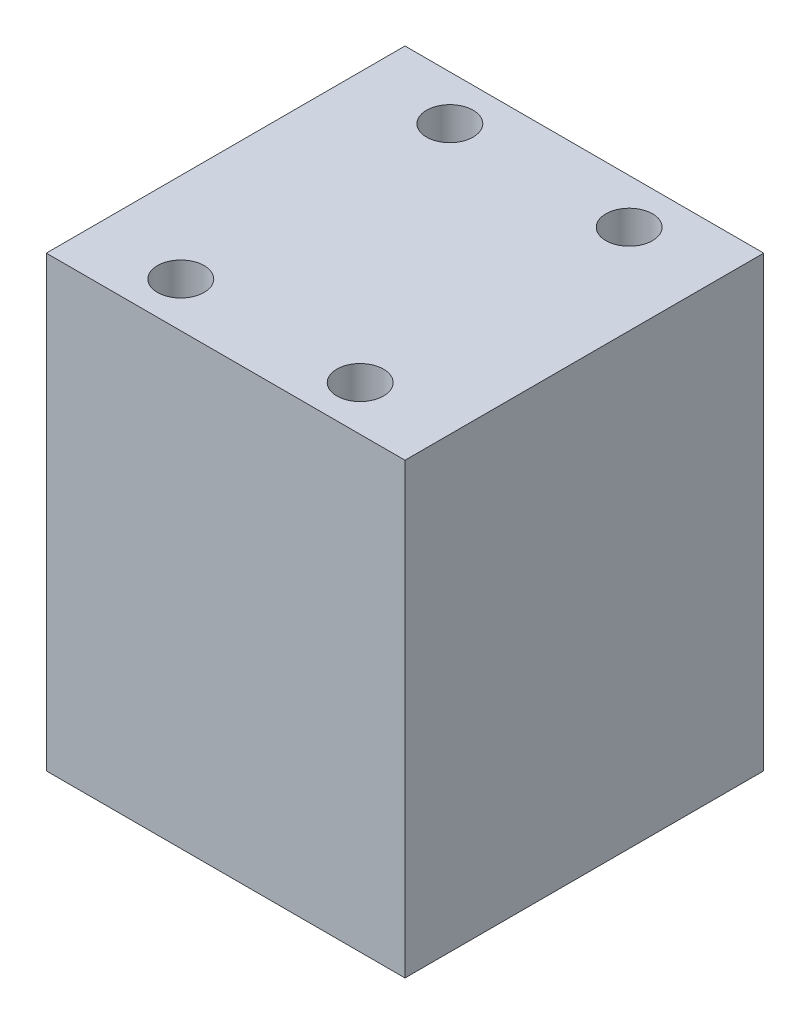
ISO-10303-21;
HEADER;
FILE_DESCRIPTION(('STEP AP214'),'2;1');
FILE_NAME('part.step','',(''),(''),'','','');
FILE_SCHEMA(('AUTOMOTIVE_DESIGN { 1 0 10303 214 1 1 1 1 }'));
ENDSEC;
DATA;
#1=APPLICATION_CONTEXT('core data for automotive mechanical design processes');
#2=APPLICATION_PROTOCOL_DEFINITION('international standard','automotive_design',2000,#1);
#3=PRODUCT_CONTEXT('',#1,'mechanical');
#4=PRODUCT('Part','Part','',(#3));
#5=PRODUCT_RELATED_PRODUCT_CATEGORY('part','',(#4));
#6=PRODUCT_DEFINITION_FORMATION('','',#4);
#7=PRODUCT_DEFINITION_CONTEXT('part definition',#1,'design');
#8=PRODUCT_DEFINITION('design','',#6,#7);
#9=PRODUCT_DEFINITION_SHAPE('','',#8);
#10=(LENGTH_UNIT() NAMED_UNIT(*) SI_UNIT(.MILLI.,.METRE.));
#11=(NAMED_UNIT(*) PLANE_ANGLE_UNIT() SI_UNIT($,.RADIAN.));
#12=(NAMED_UNIT(*) SI_UNIT($,.STERADIAN.) SOLID_ANGLE_UNIT());
#13=UNCERTAINTY_MEASURE_WITH_UNIT(LENGTH_MEASURE(1.E-05),#10,'distance_accuracy_value','');
#14=(GEOMETRIC_REPRESENTATION_CONTEXT(3) GLOBAL_UNCERTAINTY_ASSIGNED_CONTEXT((#13)) GLOBAL_UNIT_ASSIGNED_CONTEXT((#10,
#11,#12)) REPRESENTATION_CONTEXT('',''));
#15=CARTESIAN_POINT('',(0.,0.,0.));
#16=DIRECTION('',(0.,0.,1.));
#17=DIRECTION('',(1.,0.,0.));
#18=AXIS2_PLACEMENT_3D('',#15,#16,#17);
#19=CARTESIAN_POINT('',(20.,50.,-20.));
#20=DIRECTION('',(-1.,0.,0.));
#21=DIRECTION('',(0.,0.,1.));
#22=AXIS2_PLACEMENT_3D('',#19,#20,#21);
#23=PLANE('',#22);
#24=DIRECTION('',(0.,0.,-1.));
#25=VECTOR('',#24,1.);
#26=CARTESIAN_POINT('',(20.,0.,-20.));
#27=LINE('',#26,#25);
#28=CARTESIAN_POINT('',(20.,0.,20.));
#29=VERTEX_POINT('',#28);
#30=CARTESIAN_POINT('',(20.,0.,-20.));
#31=VERTEX_POINT('',#30);
#32=EDGE_CURVE('E96',#29,#31,#27,.T.);
#33=ORIENTED_EDGE('',*,*,#32,.T.);
#34=DIRECTION('',(0.,-1.,0.));
#35=VECTOR('',#34,1.);
#36=CARTESIAN_POINT('',(20.,50.,-20.));
#37=LINE('',#36,#35);
#38=CARTESIAN_POINT('',(20.,50.,-20.));
#39=VERTEX_POINT('',#38);
#40=EDGE_CURVE('E11',#39,#31,#37,.T.);
#41=ORIENTED_EDGE('',*,*,#40,.F.);
#42=DIRECTION('',(0.,0.,-1.));
#43=VECTOR('',#42,1.);
#44=CARTESIAN_POINT('',(20.,50.,-20.));
#45=LINE('',#44,#43);
#46=CARTESIAN_POINT('',(20.,50.,20.));
#47=VERTEX_POINT('',#46);
#48=EDGE_CURVE('E84',#47,#39,#45,.T.);
#49=ORIENTED_EDGE('',*,*,#48,.F.);
#50=DIRECTION('',(0.,-1.,0.));
#51=VECTOR('',#50,1.);
#52=CARTESIAN_POINT('',(20.,50.,20.));
#53=LINE('',#52,#51);
#54=EDGE_CURVE('E92',#47,#29,#53,.T.);
#55=ORIENTED_EDGE('',*,*,#54,.T.);
#56=EDGE_LOOP('',(#33,#41,#49,#55));
#57=FACE_BOUND('',#56,.T.);
#58=ADVANCED_FACE('F33',(#57),#23,.F.);
#59=CARTESIAN_POINT('',(-20.,50.,-20.));
#60=DIRECTION('',(0.,0.,1.));
#61=DIRECTION('',(1.,0.,0.));
#62=AXIS2_PLACEMENT_3D('',#59,#60,#61);
#63=PLANE('',#62);
#64=DIRECTION('',(-1.,0.,0.));
#65=VECTOR('',#64,1.);
#66=CARTESIAN_POINT('',(-20.,0.,-20.));
#67=LINE('',#66,#65);
#68=CARTESIAN_POINT('',(-20.,0.,-20.));
#69=VERTEX_POINT('',#68);
#70=EDGE_CURVE('E88',#31,#69,#67,.T.);
#71=ORIENTED_EDGE('',*,*,#70,.T.);
#72=DIRECTION('',(0.,-1.,0.));
#73=VECTOR('',#72,1.);
#74=CARTESIAN_POINT('',(-20.,50.,-20.));
#75=LINE('',#74,#73);
#76=CARTESIAN_POINT('',(-20.,50.,-20.));
#77=VERTEX_POINT('',#76);
#78=EDGE_CURVE('E41',#77,#69,#75,.T.);
#79=ORIENTED_EDGE('',*,*,#78,.F.);
#80=DIRECTION('',(-1.,0.,0.));
#81=VECTOR('',#80,1.);
#82=CARTESIAN_POINT('',(-20.,50.,-20.));
#83=LINE('',#82,#81);
#84=EDGE_CURVE('E79',#39,#77,#83,.T.);
#85=ORIENTED_EDGE('',*,*,#84,.F.);
#86=ORIENTED_EDGE('',*,*,#40,.T.);
#87=EDGE_LOOP('',(#71,#79,#85,#86));
#88=FACE_BOUND('',#87,.T.);
#89=ADVANCED_FACE('F87',(#88),#63,.F.);
#90=CARTESIAN_POINT('',(-20.,50.,-20.));
#91=DIRECTION('',(1.,0.,0.));
#92=DIRECTION('',(0.,0.,-1.));
#93=AXIS2_PLACEMENT_3D('',#90,#91,#92);
#94=PLANE('',#93);
#95=DIRECTION('',(0.,0.,1.));
#96=VECTOR('',#95,1.);
#97=CARTESIAN_POINT('',(-20.,0.,-20.));
#98=LINE('',#97,#96);
#99=CARTESIAN_POINT('',(-20.,0.,20.));
#100=VERTEX_POINT('',#99);
#101=EDGE_CURVE('E66',#69,#100,#98,.T.);
#102=ORIENTED_EDGE('',*,*,#101,.T.);
#103=DIRECTION('',(0.,-1.,0.));
#104=VECTOR('',#103,1.);
#105=CARTESIAN_POINT('',(-20.,50.,20.));
#106=LINE('',#105,#104);
#107=CARTESIAN_POINT('',(-20.,50.,20.));
#108=VERTEX_POINT('',#107);
#109=EDGE_CURVE('E89',#108,#100,#106,.T.);
#110=ORIENTED_EDGE('',*,*,#109,.F.);
#111=DIRECTION('',(0.,0.,1.));
#112=VECTOR('',#111,1.);
#113=CARTESIAN_POINT('',(-20.,50.,-20.));
#114=LINE('',#113,#112);
#115=EDGE_CURVE('E82',#77,#108,#114,.T.);
#116=ORIENTED_EDGE('',*,*,#115,.F.);
#117=ORIENTED_EDGE('',*,*,#78,.T.);
#118=EDGE_LOOP('',(#102,#110,#116,#117));
#119=FACE_BOUND('',#118,.T.);
#120=ADVANCED_FACE('F90',(#119),#94,.F.);
#121=CARTESIAN_POINT('',(-20.,50.,20.));
#122=DIRECTION('',(0.,0.,-1.));
#123=DIRECTION('',(-1.,0.,0.));
#124=AXIS2_PLACEMENT_3D('',#121,#122,#123);
#125=PLANE('',#124);
#126=DIRECTION('',(1.,0.,0.));
#127=VECTOR('',#126,1.);
#128=CARTESIAN_POINT('',(-20.,0.,20.));
#129=LINE('',#128,#127);
#130=EDGE_CURVE('E72',#100,#29,#129,.T.);
#131=ORIENTED_EDGE('',*,*,#130,.T.);
#132=ORIENTED_EDGE('',*,*,#54,.F.);
#133=DIRECTION('',(1.,0.,0.));
#134=VECTOR('',#133,1.);
#135=CARTESIAN_POINT('',(-20.,50.,20.));
#136=LINE('',#135,#134);
#137=EDGE_CURVE('E49',#108,#47,#136,.T.);
#138=ORIENTED_EDGE('',*,*,#137,.F.);
#139=ORIENTED_EDGE('',*,*,#109,.T.);
#140=EDGE_LOOP('',(#131,#132,#138,#139));
#141=FACE_BOUND('',#140,.T.);
#142=ADVANCED_FACE('F104',(#141),#125,.F.);
#143=CARTESIAN_POINT('',(0.,50.,0.));
#144=DIRECTION('',(0.,1.,0.));
#145=DIRECTION('',(0.,0.,1.));
#146=AXIS2_PLACEMENT_3D('',#143,#144,#145);
#147=PLANE('',#146);
#148=CARTESIAN_POINT('',(10.,50.,15.));
#149=DIRECTION('',(0.,1.,0.));
#150=DIRECTION('',(0.,0.,1.));
#151=AXIS2_PLACEMENT_3D('',#148,#149,#150);
#152=CIRCLE('',#151,2.6);
#153=CARTESIAN_POINT('',(10.,50.,17.6));
#154=VERTEX_POINT('',#153);
#155=EDGE_CURVE('E116',#154,#154,#152,.T.);
#156=ORIENTED_EDGE('',*,*,#155,.F.);
#157=EDGE_LOOP('',(#156));
#158=FACE_BOUND('',#157,.T.);
#159=CARTESIAN_POINT('',(-10.,50.,-15.));
#160=DIRECTION('',(0.,1.,0.));
#161=DIRECTION('',(0.,0.,1.));
#162=AXIS2_PLACEMENT_3D('',#159,#160,#161);
#163=CIRCLE('',#162,2.6);
#164=CARTESIAN_POINT('',(-10.,50.,-12.4));
#165=VERTEX_POINT('',#164);
#166=EDGE_CURVE('E122',#165,#165,#163,.T.);
#167=ORIENTED_EDGE('',*,*,#166,.F.);
#168=EDGE_LOOP('',(#167));
#169=FACE_BOUND('',#168,.T.);
#170=CARTESIAN_POINT('',(-10.,50.,15.));
#171=DIRECTION('',(0.,1.,0.));
#172=DIRECTION('',(0.,0.,1.));
#173=AXIS2_PLACEMENT_3D('',#170,#171,#172);
#174=CIRCLE('',#173,2.6);
#175=CARTESIAN_POINT('',(-10.,50.,17.6));
#176=VERTEX_POINT('',#175);
#177=EDGE_CURVE('E128',#176,#176,#174,.T.);
#178=ORIENTED_EDGE('',*,*,#177,.F.);
#179=EDGE_LOOP('',(#178));
#180=FACE_BOUND('',#179,.T.);
#181=CARTESIAN_POINT('',(10.,50.,-15.));
#182=DIRECTION('',(0.,1.,0.));
#183=DIRECTION('',(0.,0.,1.));
#184=AXIS2_PLACEMENT_3D('',#181,#182,#183);
#185=CIRCLE('',#184,2.6);
#186=CARTESIAN_POINT('',(10.,50.,-12.4));
#187=VERTEX_POINT('',#186);
#188=EDGE_CURVE('E110',#187,#187,#185,.T.);
#189=ORIENTED_EDGE('',*,*,#188,.F.);
#190=EDGE_LOOP('',(#189));
#191=FACE_BOUND('',#190,.T.);
#192=ORIENTED_EDGE('',*,*,#48,.T.);
#193=ORIENTED_EDGE('',*,*,#84,.T.);
#194=ORIENTED_EDGE('',*,*,#115,.T.);
#195=ORIENTED_EDGE('',*,*,#137,.T.);
#196=EDGE_LOOP('',(#192,#193,#194,#195));
#197=FACE_BOUND('',#196,.T.);
#198=ADVANCED_FACE('F80',(#158,#169,#180,#191,#197),#147,.T.);
#199=CARTESIAN_POINT('',(0.,0.,0.));
#200=DIRECTION('',(0.,1.,0.));
#201=DIRECTION('',(0.,0.,1.));
#202=AXIS2_PLACEMENT_3D('',#199,#200,#201);
#203=PLANE('',#202);
#204=CARTESIAN_POINT('',(10.,0.,15.));
#205=DIRECTION('',(0.,1.,0.));
#206=DIRECTION('',(0.,0.,1.));
#207=AXIS2_PLACEMENT_3D('',#204,#205,#206);
#208=CIRCLE('',#207,2.6);
#209=CARTESIAN_POINT('',(10.,0.,17.6));
#210=VERTEX_POINT('',#209);
#211=EDGE_CURVE('E119',#210,#210,#208,.T.);
#212=ORIENTED_EDGE('',*,*,#211,.T.);
#213=EDGE_LOOP('',(#212));
#214=FACE_BOUND('',#213,.T.);
#215=CARTESIAN_POINT('',(-10.,0.,-15.));
#216=DIRECTION('',(0.,1.,0.));
#217=DIRECTION('',(0.,0.,1.));
#218=AXIS2_PLACEMENT_3D('',#215,#216,#217);
#219=CIRCLE('',#218,2.6);
#220=CARTESIAN_POINT('',(-10.,0.,-12.4));
#221=VERTEX_POINT('',#220);
#222=EDGE_CURVE('E125',#221,#221,#219,.T.);
#223=ORIENTED_EDGE('',*,*,#222,.T.);
#224=EDGE_LOOP('',(#223));
#225=FACE_BOUND('',#224,.T.);
#226=CARTESIAN_POINT('',(-10.,0.,15.));
#227=DIRECTION('',(0.,1.,0.));
#228=DIRECTION('',(0.,0.,1.));
#229=AXIS2_PLACEMENT_3D('',#226,#227,#228);
#230=CIRCLE('',#229,2.6);
#231=CARTESIAN_POINT('',(-10.,0.,17.6));
#232=VERTEX_POINT('',#231);
#233=EDGE_CURVE('E113',#232,#232,#230,.T.);
#234=ORIENTED_EDGE('',*,*,#233,.T.);
#235=EDGE_LOOP('',(#234));
#236=FACE_BOUND('',#235,.T.);
#237=CARTESIAN_POINT('',(10.,0.,-15.));
#238=DIRECTION('',(0.,1.,0.));
#239=DIRECTION('',(0.,0.,1.));
#240=AXIS2_PLACEMENT_3D('',#237,#238,#239);
#241=CIRCLE('',#240,2.6);
#242=CARTESIAN_POINT('',(10.,0.,-12.4));
#243=VERTEX_POINT('',#242);
#244=EDGE_CURVE('E99',#243,#243,#241,.T.);
#245=ORIENTED_EDGE('',*,*,#244,.T.);
#246=EDGE_LOOP('',(#245));
#247=FACE_BOUND('',#246,.T.);
#248=ORIENTED_EDGE('',*,*,#32,.F.);
#249=ORIENTED_EDGE('',*,*,#130,.F.);
#250=ORIENTED_EDGE('',*,*,#101,.F.);
#251=ORIENTED_EDGE('',*,*,#70,.F.);
#252=EDGE_LOOP('',(#248,#249,#250,#251));
#253=FACE_BOUND('',#252,.T.);
#254=ADVANCED_FACE('F107',(#214,#225,#236,#247,#253),#203,.F.);
#255=CARTESIAN_POINT('',(10.,0.,-15.));
#256=DIRECTION('',(0.,1.,0.));
#257=DIRECTION('',(0.,0.,1.));
#258=AXIS2_PLACEMENT_3D('',#255,#256,#257);
#259=CYLINDRICAL_SURFACE('',#258,2.6);
#260=ORIENTED_EDGE('',*,*,#244,.F.);
#261=EDGE_LOOP('',(#260));
#262=FACE_BOUND('',#261,.T.);
#263=ORIENTED_EDGE('',*,*,#188,.T.);
#264=EDGE_LOOP('',(#263));
#265=FACE_BOUND('',#264,.T.);
#266=ADVANCED_FACE('F140',(#262,#265),#259,.F.);
#267=CARTESIAN_POINT('',(-10.,0.,15.));
#268=DIRECTION('',(0.,1.,0.));
#269=DIRECTION('',(0.,0.,1.));
#270=AXIS2_PLACEMENT_3D('',#267,#268,#269);
#271=CYLINDRICAL_SURFACE('',#270,2.6);
#272=ORIENTED_EDGE('',*,*,#233,.F.);
#273=EDGE_LOOP('',(#272));
#274=FACE_BOUND('',#273,.T.);
#275=ORIENTED_EDGE('',*,*,#177,.T.);
#276=EDGE_LOOP('',(#275));
#277=FACE_BOUND('',#276,.T.);
#278=ADVANCED_FACE('F136',(#274,#277),#271,.F.);
#279=CARTESIAN_POINT('',(-10.,0.,-15.));
#280=DIRECTION('',(0.,1.,0.));
#281=DIRECTION('',(0.,0.,1.));
#282=AXIS2_PLACEMENT_3D('',#279,#280,#281);
#283=CYLINDRICAL_SURFACE('',#282,2.6);
#284=ORIENTED_EDGE('',*,*,#222,.F.);
#285=EDGE_LOOP('',(#284));
#286=FACE_BOUND('',#285,.T.);
#287=ORIENTED_EDGE('',*,*,#166,.T.);
#288=EDGE_LOOP('',(#287));
#289=FACE_BOUND('',#288,.T.);
#290=ADVANCED_FACE('F139',(#286,#289),#283,.F.);
#291=CARTESIAN_POINT('',(10.,0.,15.));
#292=DIRECTION('',(0.,1.,0.));
#293=DIRECTION('',(0.,0.,1.));
#294=AXIS2_PLACEMENT_3D('',#291,#292,#293);
#295=CYLINDRICAL_SURFACE('',#294,2.6);
#296=ORIENTED_EDGE('',*,*,#211,.F.);
#297=EDGE_LOOP('',(#296));
#298=FACE_BOUND('',#297,.T.);
#299=ORIENTED_EDGE('',*,*,#155,.T.);
#300=EDGE_LOOP('',(#299));
#301=FACE_BOUND('',#300,.T.);
#302=ADVANCED_FACE('F201',(#298,#301),#295,.F.);
#303=CLOSED_SHELL('',(#58,#89,#120,#142,#198,#254,#266,#278,#290,#302));
#304=MANIFOLD_SOLID_BREP('B2',#303);
#305=ADVANCED_BREP_SHAPE_REPRESENTATION('',(#18,#304),#14);
#306=SHAPE_DEFINITION_REPRESENTATION(#9,#305);
ENDSEC;
END-ISO-10303-21;
